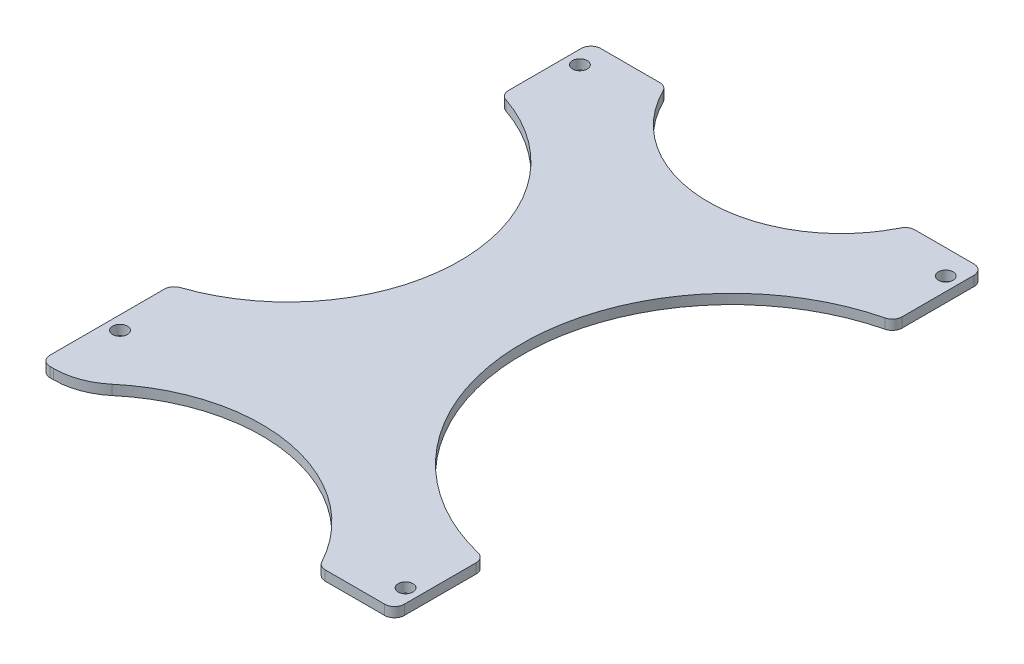
ISO-10303-21;
HEADER;
FILE_DESCRIPTION(('STEP AP214'),'2;1');
FILE_NAME('part.step','',(''),(''),'','','');
FILE_SCHEMA(('AUTOMOTIVE_DESIGN { 1 0 10303 214 1 1 1 1 }'));
ENDSEC;
DATA;
#1=APPLICATION_CONTEXT('core data for automotive mechanical design processes');
#2=APPLICATION_PROTOCOL_DEFINITION('international standard','automotive_design',2000,#1);
#3=PRODUCT_CONTEXT('',#1,'mechanical');
#4=PRODUCT('Part','Part','',(#3));
#5=PRODUCT_RELATED_PRODUCT_CATEGORY('part','',(#4));
#6=PRODUCT_DEFINITION_FORMATION('','',#4);
#7=PRODUCT_DEFINITION_CONTEXT('part definition',#1,'design');
#8=PRODUCT_DEFINITION('design','',#6,#7);
#9=PRODUCT_DEFINITION_SHAPE('','',#8);
#10=(LENGTH_UNIT() NAMED_UNIT(*) SI_UNIT(.MILLI.,.METRE.));
#11=(NAMED_UNIT(*) PLANE_ANGLE_UNIT() SI_UNIT($,.RADIAN.));
#12=(NAMED_UNIT(*) SI_UNIT($,.STERADIAN.) SOLID_ANGLE_UNIT());
#13=UNCERTAINTY_MEASURE_WITH_UNIT(LENGTH_MEASURE(1.E-05),#10,'distance_accuracy_value','');
#14=(GEOMETRIC_REPRESENTATION_CONTEXT(3) GLOBAL_UNCERTAINTY_ASSIGNED_CONTEXT((#13)) GLOBAL_UNIT_ASSIGNED_CONTEXT((#10,
#11,#12)) REPRESENTATION_CONTEXT('',''));
#15=CARTESIAN_POINT('',(0.,0.,0.));
#16=DIRECTION('',(0.,0.,1.));
#17=DIRECTION('',(1.,0.,0.));
#18=AXIS2_PLACEMENT_3D('',#15,#16,#17);
#19=CARTESIAN_POINT('',(0.,2.,0.));
#20=DIRECTION('',(1.,0.,0.));
#21=DIRECTION('',(0.,0.,-1.));
#22=AXIS2_PLACEMENT_3D('',#19,#20,#21);
#23=PLANE('',#22);
#24=DIRECTION('',(0.,0.,1.));
#25=VECTOR('',#24,1.);
#26=CARTESIAN_POINT('',(0.,0.,0.));
#27=LINE('',#26,#25);
#28=CARTESIAN_POINT('',(0.,0.,-118.));
#29=VERTEX_POINT('',#28);
#30=CARTESIAN_POINT('',(0.,0.,-103.213866665066));
#31=VERTEX_POINT('',#30);
#32=EDGE_CURVE('E280',#29,#31,#27,.T.);
#33=ORIENTED_EDGE('',*,*,#32,.T.);
#34=DIRECTION('',(0.,1.,0.));
#35=VECTOR('',#34,1.);
#36=CARTESIAN_POINT('',(0.,2.,-103.213866665066));
#37=LINE('',#36,#35);
#38=CARTESIAN_POINT('',(0.,2.,-103.213866665066));
#39=VERTEX_POINT('',#38);
#40=EDGE_CURVE('E302',#31,#39,#37,.T.);
#41=ORIENTED_EDGE('',*,*,#40,.T.);
#42=DIRECTION('',(0.,0.,1.));
#43=VECTOR('',#42,1.);
#44=CARTESIAN_POINT('',(0.,2.,0.));
#45=LINE('',#44,#43);
#46=CARTESIAN_POINT('',(0.,2.,-118.));
#47=VERTEX_POINT('',#46);
#48=EDGE_CURVE('E266',#47,#39,#45,.T.);
#49=ORIENTED_EDGE('',*,*,#48,.F.);
#50=DIRECTION('',(0.,-1.,0.));
#51=VECTOR('',#50,1.);
#52=CARTESIAN_POINT('',(0.,2.,-118.));
#53=LINE('',#52,#51);
#54=EDGE_CURVE('E299',#47,#29,#53,.T.);
#55=ORIENTED_EDGE('',*,*,#54,.T.);
#56=EDGE_LOOP('',(#33,#41,#49,#55));
#57=FACE_BOUND('',#56,.T.);
#58=ADVANCED_FACE('F37',(#57),#23,.F.);
#59=CARTESIAN_POINT('',(80.,2.,0.));
#60=DIRECTION('',(-1.,0.,0.));
#61=DIRECTION('',(0.,0.,1.));
#62=AXIS2_PLACEMENT_3D('',#59,#60,#61);
#63=PLANE('',#62);
#64=DIRECTION('',(0.,0.,-1.));
#65=VECTOR('',#64,1.);
#66=CARTESIAN_POINT('',(80.,0.,0.));
#67=LINE('',#66,#65);
#68=CARTESIAN_POINT('',(80.,0.,-2.));
#69=VERTEX_POINT('',#68);
#70=CARTESIAN_POINT('',(80.,0.,-16.6207290902577));
#71=VERTEX_POINT('',#70);
#72=EDGE_CURVE('E285',#69,#71,#67,.T.);
#73=ORIENTED_EDGE('',*,*,#72,.T.);
#74=DIRECTION('',(0.,1.,0.));
#75=VECTOR('',#74,1.);
#76=CARTESIAN_POINT('',(80.,2.,-16.6207290902577));
#77=LINE('',#76,#75);
#78=CARTESIAN_POINT('',(80.,2.,-16.6207290902577));
#79=VERTEX_POINT('',#78);
#80=EDGE_CURVE('E378',#71,#79,#77,.T.);
#81=ORIENTED_EDGE('',*,*,#80,.T.);
#82=DIRECTION('',(0.,0.,-1.));
#83=VECTOR('',#82,1.);
#84=CARTESIAN_POINT('',(80.,2.,0.));
#85=LINE('',#84,#83);
#86=CARTESIAN_POINT('',(80.,2.,-2.));
#87=VERTEX_POINT('',#86);
#88=EDGE_CURVE('E274',#87,#79,#85,.T.);
#89=ORIENTED_EDGE('',*,*,#88,.F.);
#90=DIRECTION('',(0.,-1.,0.));
#91=VECTOR('',#90,1.);
#92=CARTESIAN_POINT('',(80.,2.,-2.));
#93=LINE('',#92,#91);
#94=EDGE_CURVE('E375',#87,#69,#93,.T.);
#95=ORIENTED_EDGE('',*,*,#94,.T.);
#96=EDGE_LOOP('',(#73,#81,#89,#95));
#97=FACE_BOUND('',#96,.T.);
#98=ADVANCED_FACE('F484',(#97),#63,.F.);
#99=CARTESIAN_POINT('',(0.,2.,-120.));
#100=DIRECTION('',(0.,0.,1.));
#101=DIRECTION('',(1.,0.,0.));
#102=AXIS2_PLACEMENT_3D('',#99,#100,#101);
#103=PLANE('',#102);
#104=DIRECTION('',(-1.,0.,0.));
#105=VECTOR('',#104,1.);
#106=CARTESIAN_POINT('',(0.,0.,-120.));
#107=LINE('',#106,#105);
#108=CARTESIAN_POINT('',(78.,0.,-120.));
#109=VERTEX_POINT('',#108);
#110=CARTESIAN_POINT('',(65.9747836178067,0.,-120.));
#111=VERTEX_POINT('',#110);
#112=EDGE_CURVE('E267',#109,#111,#107,.T.);
#113=ORIENTED_EDGE('',*,*,#112,.T.);
#114=DIRECTION('',(0.,1.,0.));
#115=VECTOR('',#114,1.);
#116=CARTESIAN_POINT('',(65.9747836178067,2.,-120.));
#117=LINE('',#116,#115);
#118=CARTESIAN_POINT('',(65.9747836178067,2.,-120.));
#119=VERTEX_POINT('',#118);
#120=EDGE_CURVE('E363',#111,#119,#117,.T.);
#121=ORIENTED_EDGE('',*,*,#120,.T.);
#122=DIRECTION('',(-1.,0.,0.));
#123=VECTOR('',#122,1.);
#124=CARTESIAN_POINT('',(0.,2.,-120.));
#125=LINE('',#124,#123);
#126=CARTESIAN_POINT('',(78.,2.,-120.));
#127=VERTEX_POINT('',#126);
#128=EDGE_CURVE('E278',#127,#119,#125,.T.);
#129=ORIENTED_EDGE('',*,*,#128,.F.);
#130=DIRECTION('',(0.,-1.,0.));
#131=VECTOR('',#130,1.);
#132=CARTESIAN_POINT('',(78.,2.,-120.));
#133=LINE('',#132,#131);
#134=EDGE_CURVE('E360',#127,#109,#133,.T.);
#135=ORIENTED_EDGE('',*,*,#134,.T.);
#136=EDGE_LOOP('',(#113,#121,#129,#135));
#137=FACE_BOUND('',#136,.T.);
#138=ADVANCED_FACE('F435',(#137),#103,.F.);
#139=CARTESIAN_POINT('',(0.,2.,-33.1361333349337));
#140=VERTEX_POINT('',#139);
#141=CARTESIAN_POINT('',(0.,2.,-9.84999999999996));
#142=VERTEX_POINT('',#141);
#143=EDGE_CURVE('E263',#140,#142,#45,.T.);
#144=ORIENTED_EDGE('',*,*,#143,.F.);
#145=DIRECTION('',(0.,1.,0.));
#146=VECTOR('',#145,1.);
#147=CARTESIAN_POINT('',(0.,2.,-33.1361333349337));
#148=LINE('',#147,#146);
#149=CARTESIAN_POINT('',(0.,0.,-33.1361333349337));
#150=VERTEX_POINT('',#149);
#151=EDGE_CURVE('E45',#140,#150,#148,.F.);
#152=ORIENTED_EDGE('',*,*,#151,.T.);
#153=CARTESIAN_POINT('',(0.,0.,-9.84999999999996));
#154=VERTEX_POINT('',#153);
#155=EDGE_CURVE('E260',#150,#154,#27,.T.);
#156=ORIENTED_EDGE('',*,*,#155,.T.);
#157=DIRECTION('',(0.,1.,0.));
#158=VECTOR('',#157,1.);
#159=CARTESIAN_POINT('',(0.,2.,-9.84999999999996));
#160=LINE('',#159,#158);
#161=EDGE_CURVE('E387',#154,#142,#160,.T.);
#162=ORIENTED_EDGE('',*,*,#161,.T.);
#163=EDGE_LOOP('',(#144,#152,#156,#162));
#164=FACE_BOUND('',#163,.T.);
#165=ADVANCED_FACE('F391',(#164),#23,.F.);
#166=CARTESIAN_POINT('',(0.,2.,0.));
#167=DIRECTION('',(0.,0.,-1.));
#168=DIRECTION('',(-1.,0.,0.));
#169=AXIS2_PLACEMENT_3D('',#166,#167,#168);
#170=PLANE('',#169);
#171=DIRECTION('',(1.,0.,0.));
#172=VECTOR('',#171,1.);
#173=CARTESIAN_POINT('',(0.,2.,0.));
#174=LINE('',#173,#172);
#175=CARTESIAN_POINT('',(65.8939285812816,2.,0.));
#176=VERTEX_POINT('',#175);
#177=CARTESIAN_POINT('',(78.,2.,0.));
#178=VERTEX_POINT('',#177);
#179=EDGE_CURVE('E268',#176,#178,#174,.T.);
#180=ORIENTED_EDGE('',*,*,#179,.F.);
#181=DIRECTION('',(0.,1.,0.));
#182=VECTOR('',#181,1.);
#183=CARTESIAN_POINT('',(65.8939285812816,2.,0.));
#184=LINE('',#183,#182);
#185=CARTESIAN_POINT('',(65.8939285812816,0.,0.));
#186=VERTEX_POINT('',#185);
#187=EDGE_CURVE('E383',#176,#186,#184,.F.);
#188=ORIENTED_EDGE('',*,*,#187,.T.);
#189=DIRECTION('',(1.,0.,0.));
#190=VECTOR('',#189,1.);
#191=CARTESIAN_POINT('',(0.,0.,0.));
#192=LINE('',#191,#190);
#193=CARTESIAN_POINT('',(78.,0.,0.));
#194=VERTEX_POINT('',#193);
#195=EDGE_CURVE('E281',#186,#194,#192,.T.);
#196=ORIENTED_EDGE('',*,*,#195,.T.);
#197=DIRECTION('',(0.,-1.,0.));
#198=VECTOR('',#197,1.);
#199=CARTESIAN_POINT('',(78.,2.,0.));
#200=LINE('',#199,#198);
#201=EDGE_CURVE('E381',#194,#178,#200,.F.);
#202=ORIENTED_EDGE('',*,*,#201,.T.);
#203=EDGE_LOOP('',(#180,#188,#196,#202));
#204=FACE_BOUND('',#203,.T.);
#205=ADVANCED_FACE('F476',(#204),#170,.F.);
#206=CARTESIAN_POINT('',(80.,2.,-103.379270909742));
#207=VERTEX_POINT('',#206);
#208=CARTESIAN_POINT('',(80.,2.,-118.));
#209=VERTEX_POINT('',#208);
#210=EDGE_CURVE('E271',#207,#209,#85,.T.);
#211=ORIENTED_EDGE('',*,*,#210,.F.);
#212=DIRECTION('',(0.,1.,0.));
#213=VECTOR('',#212,1.);
#214=CARTESIAN_POINT('',(80.,2.,-103.379270909742));
#215=LINE('',#214,#213);
#216=CARTESIAN_POINT('',(80.,0.,-103.379270909742));
#217=VERTEX_POINT('',#216);
#218=EDGE_CURVE('E373',#207,#217,#215,.F.);
#219=ORIENTED_EDGE('',*,*,#218,.T.);
#220=CARTESIAN_POINT('',(80.,0.,-118.));
#221=VERTEX_POINT('',#220);
#222=EDGE_CURVE('E284',#217,#221,#67,.T.);
#223=ORIENTED_EDGE('',*,*,#222,.T.);
#224=DIRECTION('',(0.,-1.,0.));
#225=VECTOR('',#224,1.);
#226=CARTESIAN_POINT('',(80.,2.,-118.));
#227=LINE('',#226,#225);
#228=EDGE_CURVE('E371',#221,#209,#227,.F.);
#229=ORIENTED_EDGE('',*,*,#228,.T.);
#230=EDGE_LOOP('',(#211,#219,#223,#229));
#231=FACE_BOUND('',#230,.T.);
#232=ADVANCED_FACE('F448',(#231),#63,.F.);
#233=CARTESIAN_POINT('',(14.0252163821933,2.,-120.));
#234=VERTEX_POINT('',#233);
#235=CARTESIAN_POINT('',(1.99999999999999,2.,-120.));
#236=VERTEX_POINT('',#235);
#237=EDGE_CURVE('E275',#234,#236,#125,.T.);
#238=ORIENTED_EDGE('',*,*,#237,.F.);
#239=DIRECTION('',(0.,1.,0.));
#240=VECTOR('',#239,1.);
#241=CARTESIAN_POINT('',(14.0252163821933,2.,-120.));
#242=LINE('',#241,#240);
#243=CARTESIAN_POINT('',(14.0252163821933,0.,-120.));
#244=VERTEX_POINT('',#243);
#245=EDGE_CURVE('E353',#234,#244,#242,.F.);
#246=ORIENTED_EDGE('',*,*,#245,.T.);
#247=CARTESIAN_POINT('',(1.99999999999999,0.,-120.));
#248=VERTEX_POINT('',#247);
#249=EDGE_CURVE('E288',#244,#248,#107,.T.);
#250=ORIENTED_EDGE('',*,*,#249,.T.);
#251=DIRECTION('',(0.,-1.,0.));
#252=VECTOR('',#251,1.);
#253=CARTESIAN_POINT('',(1.99999999999999,2.,-120.));
#254=LINE('',#253,#252);
#255=EDGE_CURVE('E351',#248,#236,#254,.F.);
#256=ORIENTED_EDGE('',*,*,#255,.T.);
#257=EDGE_LOOP('',(#238,#246,#250,#256));
#258=FACE_BOUND('',#257,.T.);
#259=ADVANCED_FACE('F418',(#258),#103,.F.);
#260=CARTESIAN_POINT('',(0.,2.,0.));
#261=DIRECTION('',(0.,-1.,0.));
#262=DIRECTION('',(0.,0.,-1.));
#263=AXIS2_PLACEMENT_3D('',#260,#261,#262);
#264=PLANE('',#263);
#265=CARTESIAN_POINT('',(2.75,2.,-21.35));
#266=DIRECTION('',(0.,1.,0.));
#267=DIRECTION('',(0.,0.,1.));
#268=AXIS2_PLACEMENT_3D('',#265,#266,#267);
#269=CIRCLE('',#268,1.5);
#270=CARTESIAN_POINT('',(2.75,2.,-19.85));
#271=VERTEX_POINT('',#270);
#272=EDGE_CURVE('E252',#271,#271,#269,.T.);
#273=ORIENTED_EDGE('',*,*,#272,.F.);
#274=EDGE_LOOP('',(#273));
#275=FACE_BOUND('',#274,.T.);
#276=CARTESIAN_POINT('',(77.25,2.,-5.));
#277=DIRECTION('',(0.,1.,0.));
#278=DIRECTION('',(0.,0.,1.));
#279=AXIS2_PLACEMENT_3D('',#276,#277,#278);
#280=CIRCLE('',#279,1.5);
#281=CARTESIAN_POINT('',(77.25,2.,-3.50000000000001));
#282=VERTEX_POINT('',#281);
#283=EDGE_CURVE('E246',#282,#282,#280,.T.);
#284=ORIENTED_EDGE('',*,*,#283,.F.);
#285=EDGE_LOOP('',(#284));
#286=FACE_BOUND('',#285,.T.);
#287=CARTESIAN_POINT('',(77.25,2.,-115.));
#288=DIRECTION('',(0.,1.,0.));
#289=DIRECTION('',(0.,0.,-1.));
#290=AXIS2_PLACEMENT_3D('',#287,#288,#289);
#291=CIRCLE('',#290,1.5);
#292=CARTESIAN_POINT('',(77.25,2.,-116.5));
#293=VERTEX_POINT('',#292);
#294=EDGE_CURVE('E239',#293,#293,#291,.T.);
#295=ORIENTED_EDGE('',*,*,#294,.F.);
#296=EDGE_LOOP('',(#295));
#297=FACE_BOUND('',#296,.T.);
#298=CARTESIAN_POINT('',(2.74999999999999,2.,-115.));
#299=DIRECTION('',(0.,1.,0.));
#300=DIRECTION('',(0.,0.,1.));
#301=AXIS2_PLACEMENT_3D('',#298,#299,#300);
#302=CIRCLE('',#301,1.5);
#303=CARTESIAN_POINT('',(2.74999999999999,2.,-113.5));
#304=VERTEX_POINT('',#303);
#305=EDGE_CURVE('E242',#304,#304,#302,.T.);
#306=ORIENTED_EDGE('',*,*,#305,.F.);
#307=EDGE_LOOP('',(#306));
#308=FACE_BOUND('',#307,.T.);
#309=ORIENTED_EDGE('',*,*,#48,.T.);
#310=CARTESIAN_POINT('',(1.99999999999999,2.,-103.213866665066));
#311=DIRECTION('',(0.,-1.,0.));
#312=DIRECTION('',(0.,0.,-1.));
#313=AXIS2_PLACEMENT_3D('',#310,#311,#312);
#314=CIRCLE('',#313,2.);
#315=CARTESIAN_POINT('',(1.35751163343088,2.,-101.31987387236));
#316=VERTEX_POINT('',#315);
#317=EDGE_CURVE('E325',#39,#316,#314,.F.);
#318=ORIENTED_EDGE('',*,*,#317,.T.);
#319=CARTESIAN_POINT('',(-9.88603478152854,2.,-68.175));
#320=DIRECTION('',(0.,1.,0.));
#321=DIRECTION('',(0.,0.,-1.));
#322=AXIS2_PLACEMENT_3D('',#319,#320,#321);
#323=CIRCLE('',#322,35.);
#324=CARTESIAN_POINT('',(1.35751163343088,2.,-35.03012612764));
#325=VERTEX_POINT('',#324);
#326=EDGE_CURVE('E226',#325,#316,#323,.T.);
#327=ORIENTED_EDGE('',*,*,#326,.F.);
#328=CARTESIAN_POINT('',(2.,2.,-33.1361333349337));
#329=DIRECTION('',(0.,-1.,0.));
#330=DIRECTION('',(0.,0.,-1.));
#331=AXIS2_PLACEMENT_3D('',#328,#329,#330);
#332=CIRCLE('',#331,2.);
#333=EDGE_CURVE('E313',#325,#140,#332,.F.);
#334=ORIENTED_EDGE('',*,*,#333,.T.);
#335=ORIENTED_EDGE('',*,*,#143,.T.);
#336=CARTESIAN_POINT('',(2.,2.,-9.84999999999996));
#337=DIRECTION('',(0.,-1.,0.));
#338=DIRECTION('',(0.,0.,-1.));
#339=AXIS2_PLACEMENT_3D('',#336,#337,#338);
#340=CIRCLE('',#339,2.);
#341=CARTESIAN_POINT('',(2.,2.,-7.84999999999996));
#342=VERTEX_POINT('',#341);
#343=EDGE_CURVE('E311',#142,#342,#340,.F.);
#344=ORIENTED_EDGE('',*,*,#343,.T.);
#345=DIRECTION('',(-1.,0.,0.));
#346=VECTOR('',#345,1.);
#347=CARTESIAN_POINT('',(2.75000000000014,2.,-7.84999999999996));
#348=LINE('',#347,#346);
#349=CARTESIAN_POINT('',(2.75000000000014,2.,-7.84999999999996));
#350=VERTEX_POINT('',#349);
#351=EDGE_CURVE('E210',#350,#342,#348,.T.);
#352=ORIENTED_EDGE('',*,*,#351,.F.);
#353=CARTESIAN_POINT('',(2.75,2.,-21.35));
#354=DIRECTION('',(0.,-1.,0.));
#355=DIRECTION('',(0.,0.,1.));
#356=AXIS2_PLACEMENT_3D('',#353,#354,#355);
#357=CIRCLE('',#356,13.5);
#358=CARTESIAN_POINT('',(11.4692524409016,2.,-11.0434663018145));
#359=VERTEX_POINT('',#358);
#360=EDGE_CURVE('E216',#359,#350,#357,.T.);
#361=ORIENTED_EDGE('',*,*,#360,.F.);
#362=CARTESIAN_POINT('',(33.751786456539,2.,15.2954531491038));
#363=DIRECTION('',(0.,1.,0.));
#364=DIRECTION('',(0.,0.,-1.));
#365=AXIS2_PLACEMENT_3D('',#362,#363,#364);
#366=CIRCLE('',#365,34.5);
#367=CARTESIAN_POINT('',(64.1327153141724,2.,-1.05230393703542));
#368=VERTEX_POINT('',#367);
#369=EDGE_CURVE('E199',#368,#359,#366,.T.);
#370=ORIENTED_EDGE('',*,*,#369,.F.);
#371=CARTESIAN_POINT('',(65.8939285812816,2.,-2.));
#372=DIRECTION('',(0.,-1.,0.));
#373=DIRECTION('',(0.,0.,-1.));
#374=AXIS2_PLACEMENT_3D('',#371,#372,#373);
#375=CIRCLE('',#374,2.);
#376=EDGE_CURVE('E315',#368,#176,#375,.F.);
#377=ORIENTED_EDGE('',*,*,#376,.T.);
#378=ORIENTED_EDGE('',*,*,#179,.T.);
#379=CARTESIAN_POINT('',(78.,2.,-2.));
#380=DIRECTION('',(0.,-1.,0.));
#381=DIRECTION('',(0.,0.,-1.));
#382=AXIS2_PLACEMENT_3D('',#379,#380,#381);
#383=CIRCLE('',#382,2.);
#384=EDGE_CURVE('E309',#178,#87,#383,.F.);
#385=ORIENTED_EDGE('',*,*,#384,.T.);
#386=ORIENTED_EDGE('',*,*,#88,.T.);
#387=CARTESIAN_POINT('',(78.,2.,-16.6207290902577));
#388=DIRECTION('',(0.,-1.,0.));
#389=DIRECTION('',(0.,0.,-1.));
#390=AXIS2_PLACEMENT_3D('',#387,#388,#389);
#391=CIRCLE('',#390,2.);
#392=CARTESIAN_POINT('',(78.4786995852669,2.,-18.5625959000738));
#393=VERTEX_POINT('',#392);
#394=EDGE_CURVE('E317',#79,#393,#391,.F.);
#395=ORIENTED_EDGE('',*,*,#394,.T.);
#396=CARTESIAN_POINT('',(88.6936474163452,2.,-60.));
#397=DIRECTION('',(0.,1.,0.));
#398=DIRECTION('',(0.,0.,-1.));
#399=AXIS2_PLACEMENT_3D('',#396,#397,#398);
#400=CIRCLE('',#399,42.6779054984219);
#401=CARTESIAN_POINT('',(78.4786995852669,2.,-101.437404099926));
#402=VERTEX_POINT('',#401);
#403=EDGE_CURVE('E221',#402,#393,#400,.T.);
#404=ORIENTED_EDGE('',*,*,#403,.F.);
#405=CARTESIAN_POINT('',(78.,2.,-103.379270909742));
#406=DIRECTION('',(0.,-1.,0.));
#407=DIRECTION('',(0.,0.,-1.));
#408=AXIS2_PLACEMENT_3D('',#405,#406,#407);
#409=CIRCLE('',#408,2.);
#410=EDGE_CURVE('E319',#402,#207,#409,.F.);
#411=ORIENTED_EDGE('',*,*,#410,.T.);
#412=ORIENTED_EDGE('',*,*,#210,.T.);
#413=CARTESIAN_POINT('',(78.,2.,-118.));
#414=DIRECTION('',(0.,-1.,0.));
#415=DIRECTION('',(0.,0.,-1.));
#416=AXIS2_PLACEMENT_3D('',#413,#414,#415);
#417=CIRCLE('',#416,2.);
#418=EDGE_CURVE('E307',#209,#127,#417,.F.);
#419=ORIENTED_EDGE('',*,*,#418,.T.);
#420=ORIENTED_EDGE('',*,*,#128,.T.);
#421=CARTESIAN_POINT('',(65.9747836178067,2.,-118.));
#422=DIRECTION('',(0.,-1.,0.));
#423=DIRECTION('',(0.,0.,-1.));
#424=AXIS2_PLACEMENT_3D('',#421,#422,#423);
#425=CIRCLE('',#424,2.);
#426=CARTESIAN_POINT('',(64.1834192303717,2.,-118.889389471171));
#427=VERTEX_POINT('',#426);
#428=EDGE_CURVE('E321',#119,#427,#425,.F.);
#429=ORIENTED_EDGE('',*,*,#428,.T.);
#430=CARTESIAN_POINT('',(40.,2.,-130.89614733198));
#431=DIRECTION('',(0.,1.,0.));
#432=DIRECTION('',(0.,0.,1.));
#433=AXIS2_PLACEMENT_3D('',#430,#431,#432);
#434=CIRCLE('',#433,27.);
#435=CARTESIAN_POINT('',(15.8165807696283,2.,-118.889389471171));
#436=VERTEX_POINT('',#435);
#437=EDGE_CURVE('E229',#436,#427,#434,.T.);
#438=ORIENTED_EDGE('',*,*,#437,.F.);
#439=CARTESIAN_POINT('',(14.0252163821933,2.,-118.));
#440=DIRECTION('',(0.,-1.,0.));
#441=DIRECTION('',(0.,0.,-1.));
#442=AXIS2_PLACEMENT_3D('',#439,#440,#441);
#443=CIRCLE('',#442,2.);
#444=EDGE_CURVE('E323',#436,#234,#443,.F.);
#445=ORIENTED_EDGE('',*,*,#444,.T.);
#446=ORIENTED_EDGE('',*,*,#237,.T.);
#447=CARTESIAN_POINT('',(1.99999999999999,2.,-118.));
#448=DIRECTION('',(0.,-1.,0.));
#449=DIRECTION('',(0.,0.,-1.));
#450=AXIS2_PLACEMENT_3D('',#447,#448,#449);
#451=CIRCLE('',#450,2.);
#452=EDGE_CURVE('E305',#236,#47,#451,.F.);
#453=ORIENTED_EDGE('',*,*,#452,.T.);
#454=EDGE_LOOP('',(#309,#318,#327,#334,#335,#344,#352,#361,#370,#377,#378,#385,#386,#395,#404,
#411,#412,#419,#420,#429,#438,#445,#446,#453));
#455=FACE_BOUND('',#454,.T.);
#456=ADVANCED_FACE('F224',(#275,#286,#297,#308,#455),#264,.F.);
#457=CARTESIAN_POINT('',(0.,0.,0.));
#458=DIRECTION('',(0.,-1.,0.));
#459=DIRECTION('',(0.,0.,-1.));
#460=AXIS2_PLACEMENT_3D('',#457,#458,#459);
#461=PLANE('',#460);
#462=CARTESIAN_POINT('',(-9.88603478152854,0.,-68.175));
#463=DIRECTION('',(0.,-1.,0.));
#464=DIRECTION('',(0.,0.,-1.));
#465=AXIS2_PLACEMENT_3D('',#462,#463,#464);
#466=CIRCLE('',#465,35.);
#467=CARTESIAN_POINT('',(1.35751163343088,0.,-101.31987387236));
#468=VERTEX_POINT('',#467);
#469=CARTESIAN_POINT('',(1.35751163343088,0.,-35.03012612764));
#470=VERTEX_POINT('',#469);
#471=EDGE_CURVE('E296',#468,#470,#466,.T.);
#472=ORIENTED_EDGE('',*,*,#471,.F.);
#473=CARTESIAN_POINT('',(1.99999999999999,0.,-103.213866665066));
#474=DIRECTION('',(0.,-1.,0.));
#475=DIRECTION('',(0.,0.,-1.));
#476=AXIS2_PLACEMENT_3D('',#473,#474,#475);
#477=CIRCLE('',#476,2.);
#478=EDGE_CURVE('E349',#468,#31,#477,.T.);
#479=ORIENTED_EDGE('',*,*,#478,.T.);
#480=ORIENTED_EDGE('',*,*,#32,.F.);
#481=CARTESIAN_POINT('',(1.99999999999999,0.,-118.));
#482=DIRECTION('',(0.,-1.,0.));
#483=DIRECTION('',(0.,0.,-1.));
#484=AXIS2_PLACEMENT_3D('',#481,#482,#483);
#485=CIRCLE('',#484,2.);
#486=EDGE_CURVE('E331',#29,#248,#485,.T.);
#487=ORIENTED_EDGE('',*,*,#486,.T.);
#488=ORIENTED_EDGE('',*,*,#249,.F.);
#489=CARTESIAN_POINT('',(14.0252163821933,0.,-118.));
#490=DIRECTION('',(0.,-1.,0.));
#491=DIRECTION('',(0.,0.,-1.));
#492=AXIS2_PLACEMENT_3D('',#489,#490,#491);
#493=CIRCLE('',#492,2.);
#494=CARTESIAN_POINT('',(15.8165807696283,0.,-118.889389471171));
#495=VERTEX_POINT('',#494);
#496=EDGE_CURVE('E347',#244,#495,#493,.T.);
#497=ORIENTED_EDGE('',*,*,#496,.T.);
#498=CARTESIAN_POINT('',(40.,0.,-130.89614733198));
#499=DIRECTION('',(0.,-1.,0.));
#500=DIRECTION('',(0.,0.,-1.));
#501=AXIS2_PLACEMENT_3D('',#498,#499,#500);
#502=CIRCLE('',#501,27.);
#503=CARTESIAN_POINT('',(64.1834192303717,0.,-118.889389471171));
#504=VERTEX_POINT('',#503);
#505=EDGE_CURVE('E291',#504,#495,#502,.T.);
#506=ORIENTED_EDGE('',*,*,#505,.F.);
#507=CARTESIAN_POINT('',(65.9747836178067,0.,-118.));
#508=DIRECTION('',(0.,-1.,0.));
#509=DIRECTION('',(0.,0.,-1.));
#510=AXIS2_PLACEMENT_3D('',#507,#508,#509);
#511=CIRCLE('',#510,2.);
#512=EDGE_CURVE('E345',#504,#111,#511,.T.);
#513=ORIENTED_EDGE('',*,*,#512,.T.);
#514=ORIENTED_EDGE('',*,*,#112,.F.);
#515=CARTESIAN_POINT('',(78.,0.,-118.));
#516=DIRECTION('',(0.,-1.,0.));
#517=DIRECTION('',(0.,0.,-1.));
#518=AXIS2_PLACEMENT_3D('',#515,#516,#517);
#519=CIRCLE('',#518,2.);
#520=EDGE_CURVE('E333',#109,#221,#519,.T.);
#521=ORIENTED_EDGE('',*,*,#520,.T.);
#522=ORIENTED_EDGE('',*,*,#222,.F.);
#523=CARTESIAN_POINT('',(78.,0.,-103.379270909742));
#524=DIRECTION('',(0.,-1.,0.));
#525=DIRECTION('',(0.,0.,-1.));
#526=AXIS2_PLACEMENT_3D('',#523,#524,#525);
#527=CIRCLE('',#526,2.);
#528=CARTESIAN_POINT('',(78.4786995852669,0.,-101.437404099926));
#529=VERTEX_POINT('',#528);
#530=EDGE_CURVE('E343',#217,#529,#527,.T.);
#531=ORIENTED_EDGE('',*,*,#530,.T.);
#532=CARTESIAN_POINT('',(88.6936474163452,0.,-60.));
#533=DIRECTION('',(0.,1.,0.));
#534=DIRECTION('',(0.,0.,-1.));
#535=AXIS2_PLACEMENT_3D('',#532,#533,#534);
#536=CIRCLE('',#535,42.6779054984219);
#537=CARTESIAN_POINT('',(78.4786995852669,0.,-18.5625959000738));
#538=VERTEX_POINT('',#537);
#539=EDGE_CURVE('E455',#529,#538,#536,.T.);
#540=ORIENTED_EDGE('',*,*,#539,.T.);
#541=CARTESIAN_POINT('',(78.,0.,-16.6207290902577));
#542=DIRECTION('',(0.,-1.,0.));
#543=DIRECTION('',(0.,0.,-1.));
#544=AXIS2_PLACEMENT_3D('',#541,#542,#543);
#545=CIRCLE('',#544,2.);
#546=EDGE_CURVE('E341',#538,#71,#545,.T.);
#547=ORIENTED_EDGE('',*,*,#546,.T.);
#548=ORIENTED_EDGE('',*,*,#72,.F.);
#549=CARTESIAN_POINT('',(78.,0.,-2.));
#550=DIRECTION('',(0.,-1.,0.));
#551=DIRECTION('',(0.,0.,-1.));
#552=AXIS2_PLACEMENT_3D('',#549,#550,#551);
#553=CIRCLE('',#552,2.);
#554=EDGE_CURVE('E335',#69,#194,#553,.T.);
#555=ORIENTED_EDGE('',*,*,#554,.T.);
#556=ORIENTED_EDGE('',*,*,#195,.F.);
#557=CARTESIAN_POINT('',(65.8939285812816,0.,-2.));
#558=DIRECTION('',(0.,-1.,0.));
#559=DIRECTION('',(0.,0.,-1.));
#560=AXIS2_PLACEMENT_3D('',#557,#558,#559);
#561=CIRCLE('',#560,2.);
#562=CARTESIAN_POINT('',(64.1327153141724,0.,-1.05230393703542));
#563=VERTEX_POINT('',#562);
#564=EDGE_CURVE('E339',#186,#563,#561,.T.);
#565=ORIENTED_EDGE('',*,*,#564,.T.);
#566=CARTESIAN_POINT('',(33.751786456539,0.,15.2954531491038));
#567=DIRECTION('',(0.,-1.,0.));
#568=DIRECTION('',(0.,0.,-1.));
#569=AXIS2_PLACEMENT_3D('',#566,#567,#568);
#570=CIRCLE('',#569,34.5);
#571=CARTESIAN_POINT('',(11.4692524409016,0.,-11.0434663018145));
#572=VERTEX_POINT('',#571);
#573=EDGE_CURVE('E294',#572,#563,#570,.T.);
#574=ORIENTED_EDGE('',*,*,#573,.F.);
#575=CARTESIAN_POINT('',(2.75,0.,-21.35));
#576=DIRECTION('',(0.,-1.,0.));
#577=DIRECTION('',(0.,0.,1.));
#578=AXIS2_PLACEMENT_3D('',#575,#576,#577);
#579=CIRCLE('',#578,13.5);
#580=CARTESIAN_POINT('',(2.75000000000014,0.,-7.84999999999996));
#581=VERTEX_POINT('',#580);
#582=EDGE_CURVE('E211',#572,#581,#579,.T.);
#583=ORIENTED_EDGE('',*,*,#582,.T.);
#584=DIRECTION('',(-1.,0.,0.));
#585=VECTOR('',#584,1.);
#586=CARTESIAN_POINT('',(2.75000000000014,0.,-7.84999999999996));
#587=LINE('',#586,#585);
#588=CARTESIAN_POINT('',(2.,0.,-7.84999999999996));
#589=VERTEX_POINT('',#588);
#590=EDGE_CURVE('E233',#581,#589,#587,.T.);
#591=ORIENTED_EDGE('',*,*,#590,.T.);
#592=CARTESIAN_POINT('',(2.,0.,-9.84999999999996));
#593=DIRECTION('',(0.,-1.,0.));
#594=DIRECTION('',(0.,0.,-1.));
#595=AXIS2_PLACEMENT_3D('',#592,#593,#594);
#596=CIRCLE('',#595,2.);
#597=EDGE_CURVE('E52',#589,#154,#596,.T.);
#598=ORIENTED_EDGE('',*,*,#597,.T.);
#599=ORIENTED_EDGE('',*,*,#155,.F.);
#600=CARTESIAN_POINT('',(2.,0.,-33.1361333349337));
#601=DIRECTION('',(0.,-1.,0.));
#602=DIRECTION('',(0.,0.,-1.));
#603=AXIS2_PLACEMENT_3D('',#600,#601,#602);
#604=CIRCLE('',#603,2.);
#605=EDGE_CURVE('E60',#150,#470,#604,.T.);
#606=ORIENTED_EDGE('',*,*,#605,.T.);
#607=EDGE_LOOP('',(#472,#479,#480,#487,#488,#497,#506,#513,#514,#521,#522,#531,#540,#547,#548,
#555,#556,#565,#574,#583,#591,#598,#599,#606));
#608=FACE_BOUND('',#607,.T.);
#609=CARTESIAN_POINT('',(2.75,0.,-21.35));
#610=DIRECTION('',(0.,1.,0.));
#611=DIRECTION('',(0.,0.,1.));
#612=AXIS2_PLACEMENT_3D('',#609,#610,#611);
#613=CIRCLE('',#612,1.5);
#614=CARTESIAN_POINT('',(2.75,0.,-19.85));
#615=VERTEX_POINT('',#614);
#616=EDGE_CURVE('E238',#615,#615,#613,.T.);
#617=ORIENTED_EDGE('',*,*,#616,.T.);
#618=EDGE_LOOP('',(#617));
#619=FACE_BOUND('',#618,.T.);
#620=CARTESIAN_POINT('',(77.25,0.,-5.));
#621=DIRECTION('',(0.,1.,0.));
#622=DIRECTION('',(0.,0.,1.));
#623=AXIS2_PLACEMENT_3D('',#620,#621,#622);
#624=CIRCLE('',#623,1.5);
#625=CARTESIAN_POINT('',(77.25,0.,-3.50000000000001));
#626=VERTEX_POINT('',#625);
#627=EDGE_CURVE('E249',#626,#626,#624,.T.);
#628=ORIENTED_EDGE('',*,*,#627,.T.);
#629=EDGE_LOOP('',(#628));
#630=FACE_BOUND('',#629,.T.);
#631=CARTESIAN_POINT('',(77.25,0.,-115.));
#632=DIRECTION('',(0.,1.,0.));
#633=DIRECTION('',(0.,0.,-1.));
#634=AXIS2_PLACEMENT_3D('',#631,#632,#633);
#635=CIRCLE('',#634,1.5);
#636=CARTESIAN_POINT('',(77.25,0.,-116.5));
#637=VERTEX_POINT('',#636);
#638=EDGE_CURVE('E243',#637,#637,#635,.T.);
#639=ORIENTED_EDGE('',*,*,#638,.T.);
#640=EDGE_LOOP('',(#639));
#641=FACE_BOUND('',#640,.T.);
#642=CARTESIAN_POINT('',(2.74999999999999,0.,-115.));
#643=DIRECTION('',(0.,1.,0.));
#644=DIRECTION('',(0.,0.,1.));
#645=AXIS2_PLACEMENT_3D('',#642,#643,#644);
#646=CIRCLE('',#645,1.5);
#647=CARTESIAN_POINT('',(2.74999999999999,0.,-113.5));
#648=VERTEX_POINT('',#647);
#649=EDGE_CURVE('E257',#648,#648,#646,.T.);
#650=ORIENTED_EDGE('',*,*,#649,.T.);
#651=EDGE_LOOP('',(#650));
#652=FACE_BOUND('',#651,.T.);
#653=ADVANCED_FACE('F395',(#608,#619,#630,#641,#652),#461,.T.);
#654=CARTESIAN_POINT('',(2.74999999999999,0.,-115.));
#655=DIRECTION('',(0.,1.,0.));
#656=DIRECTION('',(0.,0.,1.));
#657=AXIS2_PLACEMENT_3D('',#654,#655,#656);
#658=CYLINDRICAL_SURFACE('',#657,1.5);
#659=ORIENTED_EDGE('',*,*,#649,.F.);
#660=EDGE_LOOP('',(#659));
#661=FACE_BOUND('',#660,.T.);
#662=ORIENTED_EDGE('',*,*,#305,.T.);
#663=EDGE_LOOP('',(#662));
#664=FACE_BOUND('',#663,.T.);
#665=ADVANCED_FACE('F594',(#661,#664),#658,.F.);
#666=CARTESIAN_POINT('',(77.25,0.,-115.));
#667=DIRECTION('',(0.,1.,0.));
#668=DIRECTION('',(0.,0.,1.));
#669=AXIS2_PLACEMENT_3D('',#666,#667,#668);
#670=CYLINDRICAL_SURFACE('',#669,1.5);
#671=ORIENTED_EDGE('',*,*,#638,.F.);
#672=EDGE_LOOP('',(#671));
#673=FACE_BOUND('',#672,.T.);
#674=ORIENTED_EDGE('',*,*,#294,.T.);
#675=EDGE_LOOP('',(#674));
#676=FACE_BOUND('',#675,.T.);
#677=ADVANCED_FACE('F583',(#673,#676),#670,.F.);
#678=CARTESIAN_POINT('',(77.25,0.,-5.));
#679=DIRECTION('',(0.,1.,0.));
#680=DIRECTION('',(0.,0.,1.));
#681=AXIS2_PLACEMENT_3D('',#678,#679,#680);
#682=CYLINDRICAL_SURFACE('',#681,1.5);
#683=ORIENTED_EDGE('',*,*,#627,.F.);
#684=EDGE_LOOP('',(#683));
#685=FACE_BOUND('',#684,.T.);
#686=ORIENTED_EDGE('',*,*,#283,.T.);
#687=EDGE_LOOP('',(#686));
#688=FACE_BOUND('',#687,.T.);
#689=ADVANCED_FACE('F572',(#685,#688),#682,.F.);
#690=CARTESIAN_POINT('',(2.75,0.,-21.35));
#691=DIRECTION('',(0.,1.,0.));
#692=DIRECTION('',(0.,0.,1.));
#693=AXIS2_PLACEMENT_3D('',#690,#691,#692);
#694=CYLINDRICAL_SURFACE('',#693,1.5);
#695=ORIENTED_EDGE('',*,*,#616,.F.);
#696=EDGE_LOOP('',(#695));
#697=FACE_BOUND('',#696,.T.);
#698=ORIENTED_EDGE('',*,*,#272,.T.);
#699=EDGE_LOOP('',(#698));
#700=FACE_BOUND('',#699,.T.);
#701=ADVANCED_FACE('F567',(#697,#700),#694,.F.);
#702=CARTESIAN_POINT('',(40.,0.,-130.89614733198));
#703=DIRECTION('',(0.,1.,0.));
#704=DIRECTION('',(0.,0.,1.));
#705=AXIS2_PLACEMENT_3D('',#702,#703,#704);
#706=CYLINDRICAL_SURFACE('',#705,27.);
#707=ORIENTED_EDGE('',*,*,#505,.T.);
#708=DIRECTION('',(0.,1.,0.));
#709=VECTOR('',#708,1.);
#710=CARTESIAN_POINT('',(15.8165807696283,0.,-118.889389471171));
#711=LINE('',#710,#709);
#712=EDGE_CURVE('E358',#495,#436,#711,.T.);
#713=ORIENTED_EDGE('',*,*,#712,.T.);
#714=ORIENTED_EDGE('',*,*,#437,.T.);
#715=DIRECTION('',(0.,1.,0.));
#716=VECTOR('',#715,1.);
#717=CARTESIAN_POINT('',(64.1834192303717,0.,-118.889389471171));
#718=LINE('',#717,#716);
#719=EDGE_CURVE('E356',#427,#504,#718,.F.);
#720=ORIENTED_EDGE('',*,*,#719,.T.);
#721=EDGE_LOOP('',(#707,#713,#714,#720));
#722=FACE_BOUND('',#721,.T.);
#723=ADVANCED_FACE('F427',(#722),#706,.F.);
#724=CARTESIAN_POINT('',(88.6936474163452,0.,-60.));
#725=DIRECTION('',(0.,1.,0.));
#726=DIRECTION('',(0.,0.,1.));
#727=AXIS2_PLACEMENT_3D('',#724,#725,#726);
#728=CYLINDRICAL_SURFACE('',#727,42.6779054984219);
#729=ORIENTED_EDGE('',*,*,#539,.F.);
#730=DIRECTION('',(0.,1.,0.));
#731=VECTOR('',#730,1.);
#732=CARTESIAN_POINT('',(78.4786995852669,0.,-101.437404099926));
#733=LINE('',#732,#731);
#734=EDGE_CURVE('E368',#529,#402,#733,.T.);
#735=ORIENTED_EDGE('',*,*,#734,.T.);
#736=ORIENTED_EDGE('',*,*,#403,.T.);
#737=DIRECTION('',(0.,1.,0.));
#738=VECTOR('',#737,1.);
#739=CARTESIAN_POINT('',(78.4786995852669,0.,-18.5625959000738));
#740=LINE('',#739,#738);
#741=EDGE_CURVE('E366',#393,#538,#740,.F.);
#742=ORIENTED_EDGE('',*,*,#741,.T.);
#743=EDGE_LOOP('',(#729,#735,#736,#742));
#744=FACE_BOUND('',#743,.T.);
#745=ADVANCED_FACE('F458',(#744),#728,.F.);
#746=CARTESIAN_POINT('',(33.751786456539,0.,15.2954531491038));
#747=DIRECTION('',(0.,1.,0.));
#748=DIRECTION('',(0.,0.,1.));
#749=AXIS2_PLACEMENT_3D('',#746,#747,#748);
#750=CYLINDRICAL_SURFACE('',#749,34.5);
#751=ORIENTED_EDGE('',*,*,#573,.T.);
#752=DIRECTION('',(0.,1.,0.));
#753=VECTOR('',#752,1.);
#754=CARTESIAN_POINT('',(64.1327153141724,0.,-1.05230393703542));
#755=LINE('',#754,#753);
#756=EDGE_CURVE('E206',#563,#368,#755,.T.);
#757=ORIENTED_EDGE('',*,*,#756,.T.);
#758=ORIENTED_EDGE('',*,*,#369,.T.);
#759=DIRECTION('',(0.,1.,0.));
#760=VECTOR('',#759,1.);
#761=CARTESIAN_POINT('',(11.4692524409016,0.,-11.0434663018145));
#762=LINE('',#761,#760);
#763=EDGE_CURVE('E203',#572,#359,#762,.T.);
#764=ORIENTED_EDGE('',*,*,#763,.F.);
#765=EDGE_LOOP('',(#751,#757,#758,#764));
#766=FACE_BOUND('',#765,.T.);
#767=ADVANCED_FACE('F202',(#766),#750,.F.);
#768=CARTESIAN_POINT('',(2.75000000000014,0.,-7.84999999999996));
#769=DIRECTION('',(0.,0.,-1.));
#770=DIRECTION('',(-1.,0.,0.));
#771=AXIS2_PLACEMENT_3D('',#768,#769,#770);
#772=PLANE('',#771);
#773=ORIENTED_EDGE('',*,*,#351,.T.);
#774=DIRECTION('',(0.,1.,0.));
#775=VECTOR('',#774,1.);
#776=CARTESIAN_POINT('',(2.,0.,-7.84999999999996));
#777=LINE('',#776,#775);
#778=EDGE_CURVE('E11',#342,#589,#777,.F.);
#779=ORIENTED_EDGE('',*,*,#778,.T.);
#780=ORIENTED_EDGE('',*,*,#590,.F.);
#781=DIRECTION('',(0.,1.,0.));
#782=VECTOR('',#781,1.);
#783=CARTESIAN_POINT('',(2.75000000000014,0.,-7.84999999999996));
#784=LINE('',#783,#782);
#785=EDGE_CURVE('E220',#581,#350,#784,.T.);
#786=ORIENTED_EDGE('',*,*,#785,.T.);
#787=EDGE_LOOP('',(#773,#779,#780,#786));
#788=FACE_BOUND('',#787,.T.);
#789=ADVANCED_FACE('F467',(#788),#772,.F.);
#790=CARTESIAN_POINT('',(2.75,0.,-21.35));
#791=DIRECTION('',(0.,1.,0.));
#792=DIRECTION('',(0.,0.,1.));
#793=AXIS2_PLACEMENT_3D('',#790,#791,#792);
#794=CYLINDRICAL_SURFACE('',#793,13.5);
#795=ORIENTED_EDGE('',*,*,#360,.T.);
#796=ORIENTED_EDGE('',*,*,#785,.F.);
#797=ORIENTED_EDGE('',*,*,#582,.F.);
#798=ORIENTED_EDGE('',*,*,#763,.T.);
#799=EDGE_LOOP('',(#795,#796,#797,#798));
#800=FACE_BOUND('',#799,.T.);
#801=ADVANCED_FACE('F215',(#800),#794,.T.);
#802=CARTESIAN_POINT('',(-9.88603478152854,0.,-68.175));
#803=DIRECTION('',(0.,1.,0.));
#804=DIRECTION('',(0.,0.,1.));
#805=AXIS2_PLACEMENT_3D('',#802,#803,#804);
#806=CYLINDRICAL_SURFACE('',#805,35.);
#807=ORIENTED_EDGE('',*,*,#326,.T.);
#808=DIRECTION('',(0.,1.,0.));
#809=VECTOR('',#808,1.);
#810=CARTESIAN_POINT('',(1.35751163343088,0.,-101.31987387236));
#811=LINE('',#810,#809);
#812=EDGE_CURVE('E329',#316,#468,#811,.F.);
#813=ORIENTED_EDGE('',*,*,#812,.T.);
#814=ORIENTED_EDGE('',*,*,#471,.T.);
#815=DIRECTION('',(0.,1.,0.));
#816=VECTOR('',#815,1.);
#817=CARTESIAN_POINT('',(1.35751163343089,0.,-35.03012612764));
#818=LINE('',#817,#816);
#819=EDGE_CURVE('E327',#470,#325,#818,.T.);
#820=ORIENTED_EDGE('',*,*,#819,.T.);
#821=EDGE_LOOP('',(#807,#813,#814,#820));
#822=FACE_BOUND('',#821,.T.);
#823=ADVANCED_FACE('F399',(#822),#806,.F.);
#824=CARTESIAN_POINT('',(1.99999999999999,0.,-103.213866665066));
#825=DIRECTION('',(0.,1.,0.));
#826=DIRECTION('',(0.,0.,1.));
#827=AXIS2_PLACEMENT_3D('',#824,#825,#826);
#828=CYLINDRICAL_SURFACE('',#827,2.);
#829=ORIENTED_EDGE('',*,*,#478,.F.);
#830=ORIENTED_EDGE('',*,*,#812,.F.);
#831=ORIENTED_EDGE('',*,*,#317,.F.);
#832=ORIENTED_EDGE('',*,*,#40,.F.);
#833=EDGE_LOOP('',(#829,#830,#831,#832));
#834=FACE_BOUND('',#833,.T.);
#835=ADVANCED_FACE('F404',(#834),#828,.T.);
#836=CARTESIAN_POINT('',(14.0252163821933,0.,-118.));
#837=DIRECTION('',(0.,1.,0.));
#838=DIRECTION('',(0.,0.,1.));
#839=AXIS2_PLACEMENT_3D('',#836,#837,#838);
#840=CYLINDRICAL_SURFACE('',#839,2.);
#841=ORIENTED_EDGE('',*,*,#444,.F.);
#842=ORIENTED_EDGE('',*,*,#712,.F.);
#843=ORIENTED_EDGE('',*,*,#496,.F.);
#844=ORIENTED_EDGE('',*,*,#245,.F.);
#845=EDGE_LOOP('',(#841,#842,#843,#844));
#846=FACE_BOUND('',#845,.T.);
#847=ADVANCED_FACE('F422',(#846),#840,.T.);
#848=CARTESIAN_POINT('',(65.9747836178067,0.,-118.));
#849=DIRECTION('',(0.,1.,0.));
#850=DIRECTION('',(0.,0.,1.));
#851=AXIS2_PLACEMENT_3D('',#848,#849,#850);
#852=CYLINDRICAL_SURFACE('',#851,2.);
#853=ORIENTED_EDGE('',*,*,#512,.F.);
#854=ORIENTED_EDGE('',*,*,#719,.F.);
#855=ORIENTED_EDGE('',*,*,#428,.F.);
#856=ORIENTED_EDGE('',*,*,#120,.F.);
#857=EDGE_LOOP('',(#853,#854,#855,#856));
#858=FACE_BOUND('',#857,.T.);
#859=ADVANCED_FACE('F431',(#858),#852,.T.);
#860=CARTESIAN_POINT('',(78.,0.,-103.379270909742));
#861=DIRECTION('',(0.,1.,0.));
#862=DIRECTION('',(0.,0.,1.));
#863=AXIS2_PLACEMENT_3D('',#860,#861,#862);
#864=CYLINDRICAL_SURFACE('',#863,2.);
#865=ORIENTED_EDGE('',*,*,#530,.F.);
#866=ORIENTED_EDGE('',*,*,#218,.F.);
#867=ORIENTED_EDGE('',*,*,#410,.F.);
#868=ORIENTED_EDGE('',*,*,#734,.F.);
#869=EDGE_LOOP('',(#865,#866,#867,#868));
#870=FACE_BOUND('',#869,.T.);
#871=ADVANCED_FACE('F451',(#870),#864,.T.);
#872=CARTESIAN_POINT('',(78.,0.,-16.6207290902577));
#873=DIRECTION('',(0.,1.,0.));
#874=DIRECTION('',(0.,0.,1.));
#875=AXIS2_PLACEMENT_3D('',#872,#873,#874);
#876=CYLINDRICAL_SURFACE('',#875,2.);
#877=ORIENTED_EDGE('',*,*,#546,.F.);
#878=ORIENTED_EDGE('',*,*,#741,.F.);
#879=ORIENTED_EDGE('',*,*,#394,.F.);
#880=ORIENTED_EDGE('',*,*,#80,.F.);
#881=EDGE_LOOP('',(#877,#878,#879,#880));
#882=FACE_BOUND('',#881,.T.);
#883=ADVANCED_FACE('F488',(#882),#876,.T.);
#884=CARTESIAN_POINT('',(65.8939285812816,0.,-2.));
#885=DIRECTION('',(0.,1.,0.));
#886=DIRECTION('',(0.,0.,1.));
#887=AXIS2_PLACEMENT_3D('',#884,#885,#886);
#888=CYLINDRICAL_SURFACE('',#887,2.);
#889=ORIENTED_EDGE('',*,*,#376,.F.);
#890=ORIENTED_EDGE('',*,*,#756,.F.);
#891=ORIENTED_EDGE('',*,*,#564,.F.);
#892=ORIENTED_EDGE('',*,*,#187,.F.);
#893=EDGE_LOOP('',(#889,#890,#891,#892));
#894=FACE_BOUND('',#893,.T.);
#895=ADVANCED_FACE('F471',(#894),#888,.T.);
#896=CARTESIAN_POINT('',(2.,0.,-33.1361333349337));
#897=DIRECTION('',(0.,1.,0.));
#898=DIRECTION('',(0.,0.,1.));
#899=AXIS2_PLACEMENT_3D('',#896,#897,#898);
#900=CYLINDRICAL_SURFACE('',#899,2.);
#901=ORIENTED_EDGE('',*,*,#333,.F.);
#902=ORIENTED_EDGE('',*,*,#819,.F.);
#903=ORIENTED_EDGE('',*,*,#605,.F.);
#904=ORIENTED_EDGE('',*,*,#151,.F.);
#905=EDGE_LOOP('',(#901,#902,#903,#904));
#906=FACE_BOUND('',#905,.T.);
#907=ADVANCED_FACE('F402',(#906),#900,.T.);
#908=CARTESIAN_POINT('',(2.,2.,-9.84999999999996));
#909=DIRECTION('',(0.,1.,0.));
#910=DIRECTION('',(0.,0.,1.));
#911=AXIS2_PLACEMENT_3D('',#908,#909,#910);
#912=CYLINDRICAL_SURFACE('',#911,2.);
#913=ORIENTED_EDGE('',*,*,#597,.F.);
#914=ORIENTED_EDGE('',*,*,#778,.F.);
#915=ORIENTED_EDGE('',*,*,#343,.F.);
#916=ORIENTED_EDGE('',*,*,#161,.F.);
#917=EDGE_LOOP('',(#913,#914,#915,#916));
#918=FACE_BOUND('',#917,.T.);
#919=ADVANCED_FACE('F732',(#918),#912,.T.);
#920=CARTESIAN_POINT('',(78.,2.,-2.));
#921=DIRECTION('',(0.,-1.,0.));
#922=DIRECTION('',(0.,0.,-1.));
#923=AXIS2_PLACEMENT_3D('',#920,#921,#922);
#924=CYLINDRICAL_SURFACE('',#923,2.);
#925=ORIENTED_EDGE('',*,*,#384,.F.);
#926=ORIENTED_EDGE('',*,*,#201,.F.);
#927=ORIENTED_EDGE('',*,*,#554,.F.);
#928=ORIENTED_EDGE('',*,*,#94,.F.);
#929=EDGE_LOOP('',(#925,#926,#927,#928));
#930=FACE_BOUND('',#929,.T.);
#931=ADVANCED_FACE('F479',(#930),#924,.T.);
#932=CARTESIAN_POINT('',(78.,2.,-118.));
#933=DIRECTION('',(0.,-1.,0.));
#934=DIRECTION('',(0.,0.,-1.));
#935=AXIS2_PLACEMENT_3D('',#932,#933,#934);
#936=CYLINDRICAL_SURFACE('',#935,2.);
#937=ORIENTED_EDGE('',*,*,#418,.F.);
#938=ORIENTED_EDGE('',*,*,#228,.F.);
#939=ORIENTED_EDGE('',*,*,#520,.F.);
#940=ORIENTED_EDGE('',*,*,#134,.F.);
#941=EDGE_LOOP('',(#937,#938,#939,#940));
#942=FACE_BOUND('',#941,.T.);
#943=ADVANCED_FACE('F441',(#942),#936,.T.);
#944=CARTESIAN_POINT('',(1.99999999999999,2.,-118.));
#945=DIRECTION('',(0.,-1.,0.));
#946=DIRECTION('',(0.,0.,-1.));
#947=AXIS2_PLACEMENT_3D('',#944,#945,#946);
#948=CYLINDRICAL_SURFACE('',#947,2.);
#949=ORIENTED_EDGE('',*,*,#452,.F.);
#950=ORIENTED_EDGE('',*,*,#255,.F.);
#951=ORIENTED_EDGE('',*,*,#486,.F.);
#952=ORIENTED_EDGE('',*,*,#54,.F.);
#953=EDGE_LOOP('',(#949,#950,#951,#952));
#954=FACE_BOUND('',#953,.T.);
#955=ADVANCED_FACE('F39',(#954),#948,.T.);
#956=CLOSED_SHELL('',(#58,#98,#138,#165,#205,#232,#259,#456,#653,#665,#677,#689,#701,#723,#745,
#767,#789,#801,#823,#835,#847,#859,#871,#883,#895,#907,#919,#931,#943,#955));
#957=MANIFOLD_SOLID_BREP('B2',#956);
#958=ADVANCED_BREP_SHAPE_REPRESENTATION('',(#18,#957),#14);
#959=SHAPE_DEFINITION_REPRESENTATION(#9,#958);
ENDSEC;
END-ISO-10303-21;
